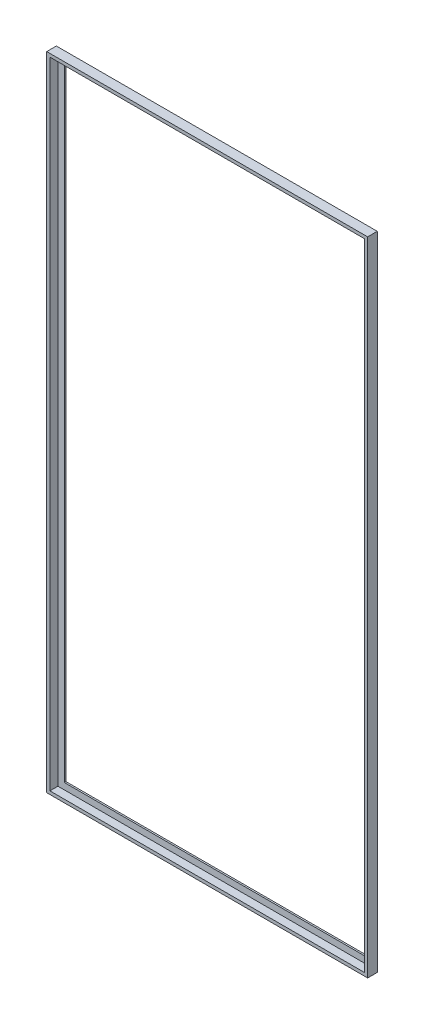
ISO-10303-21;
HEADER;
FILE_DESCRIPTION(('STEP AP214'),'2;1');
FILE_NAME('part.step','',(''),(''),'','','');
FILE_SCHEMA(('AUTOMOTIVE_DESIGN { 1 0 10303 214 1 1 1 1 }'));
ENDSEC;
DATA;
#1=APPLICATION_CONTEXT('core data for automotive mechanical design processes');
#2=APPLICATION_PROTOCOL_DEFINITION('international standard','automotive_design',2000,#1);
#3=PRODUCT_CONTEXT('',#1,'mechanical');
#4=PRODUCT('Part','Part','',(#3));
#5=PRODUCT_RELATED_PRODUCT_CATEGORY('part','',(#4));
#6=PRODUCT_DEFINITION_FORMATION('','',#4);
#7=PRODUCT_DEFINITION_CONTEXT('part definition',#1,'design');
#8=PRODUCT_DEFINITION('design','',#6,#7);
#9=PRODUCT_DEFINITION_SHAPE('','',#8);
#10=(LENGTH_UNIT() NAMED_UNIT(*) SI_UNIT(.MILLI.,.METRE.));
#11=(NAMED_UNIT(*) PLANE_ANGLE_UNIT() SI_UNIT($,.RADIAN.));
#12=(NAMED_UNIT(*) SI_UNIT($,.STERADIAN.) SOLID_ANGLE_UNIT());
#13=UNCERTAINTY_MEASURE_WITH_UNIT(LENGTH_MEASURE(1.E-05),#10,'distance_accuracy_value','');
#14=(GEOMETRIC_REPRESENTATION_CONTEXT(3) GLOBAL_UNCERTAINTY_ASSIGNED_CONTEXT((#13)) GLOBAL_UNIT_ASSIGNED_CONTEXT((#10,
#11,#12)) REPRESENTATION_CONTEXT('',''));
#15=CARTESIAN_POINT('',(0.,0.,0.));
#16=DIRECTION('',(0.,0.,1.));
#17=DIRECTION('',(1.,0.,0.));
#18=AXIS2_PLACEMENT_3D('',#15,#16,#17);
#19=CARTESIAN_POINT('',(0.,30.,5.));
#20=DIRECTION('',(0.,1.,0.));
#21=DIRECTION('',(0.,0.,1.));
#22=AXIS2_PLACEMENT_3D('',#19,#20,#21);
#23=PLANE('',#22);
#24=DIRECTION('',(1.,0.,0.));
#25=VECTOR('',#24,1.);
#26=CARTESIAN_POINT('',(0.,30.,0.));
#27=LINE('',#26,#25);
#28=CARTESIAN_POINT('',(30.,30.,0.));
#29=VERTEX_POINT('',#28);
#30=CARTESIAN_POINT('',(970.,30.,0.));
#31=VERTEX_POINT('',#30);
#32=EDGE_CURVE('E114',#29,#31,#27,.T.);
#33=ORIENTED_EDGE('',*,*,#32,.F.);
#34=DIRECTION('',(0.,0.,-1.));
#35=VECTOR('',#34,1.);
#36=CARTESIAN_POINT('',(30.,30.,5.));
#37=LINE('',#36,#35);
#38=CARTESIAN_POINT('',(30.,30.,5.));
#39=VERTEX_POINT('',#38);
#40=EDGE_CURVE('E11',#39,#29,#37,.T.);
#41=ORIENTED_EDGE('',*,*,#40,.F.);
#42=DIRECTION('',(1.,0.,0.));
#43=VECTOR('',#42,1.);
#44=CARTESIAN_POINT('',(0.,30.,5.));
#45=LINE('',#44,#43);
#46=CARTESIAN_POINT('',(970.,30.,5.));
#47=VERTEX_POINT('',#46);
#48=EDGE_CURVE('E98',#39,#47,#45,.T.);
#49=ORIENTED_EDGE('',*,*,#48,.T.);
#50=DIRECTION('',(0.,0.,-1.));
#51=VECTOR('',#50,1.);
#52=CARTESIAN_POINT('',(970.,30.,5.));
#53=LINE('',#52,#51);
#54=EDGE_CURVE('E48',#47,#31,#53,.T.);
#55=ORIENTED_EDGE('',*,*,#54,.T.);
#56=EDGE_LOOP('',(#33,#41,#49,#55));
#57=FACE_BOUND('',#56,.T.);
#58=ADVANCED_FACE('F32',(#57),#23,.T.);
#59=CARTESIAN_POINT('',(30.,0.,5.));
#60=DIRECTION('',(-1.,0.,0.));
#61=DIRECTION('',(0.,0.,1.));
#62=AXIS2_PLACEMENT_3D('',#59,#60,#61);
#63=PLANE('',#62);
#64=DIRECTION('',(0.,1.,0.));
#65=VECTOR('',#64,1.);
#66=CARTESIAN_POINT('',(30.,0.,0.));
#67=LINE('',#66,#65);
#68=CARTESIAN_POINT('',(30.,1970.,0.));
#69=VERTEX_POINT('',#68);
#70=EDGE_CURVE('E103',#29,#69,#67,.T.);
#71=ORIENTED_EDGE('',*,*,#70,.T.);
#72=DIRECTION('',(0.,0.,-1.));
#73=VECTOR('',#72,1.);
#74=CARTESIAN_POINT('',(30.,1970.,5.));
#75=LINE('',#74,#73);
#76=CARTESIAN_POINT('',(30.,1970.,5.));
#77=VERTEX_POINT('',#76);
#78=EDGE_CURVE('E40',#77,#69,#75,.T.);
#79=ORIENTED_EDGE('',*,*,#78,.F.);
#80=DIRECTION('',(0.,1.,0.));
#81=VECTOR('',#80,1.);
#82=CARTESIAN_POINT('',(30.,0.,5.));
#83=LINE('',#82,#81);
#84=EDGE_CURVE('E93',#39,#77,#83,.T.);
#85=ORIENTED_EDGE('',*,*,#84,.F.);
#86=ORIENTED_EDGE('',*,*,#40,.T.);
#87=EDGE_LOOP('',(#71,#79,#85,#86));
#88=FACE_BOUND('',#87,.T.);
#89=ADVANCED_FACE('F101',(#88),#63,.F.);
#90=CARTESIAN_POINT('',(0.,1970.,5.));
#91=DIRECTION('',(0.,1.,0.));
#92=DIRECTION('',(0.,0.,1.));
#93=AXIS2_PLACEMENT_3D('',#90,#91,#92);
#94=PLANE('',#93);
#95=DIRECTION('',(1.,0.,0.));
#96=VECTOR('',#95,1.);
#97=CARTESIAN_POINT('',(0.,1970.,0.));
#98=LINE('',#97,#96);
#99=CARTESIAN_POINT('',(970.,1970.,0.));
#100=VERTEX_POINT('',#99);
#101=EDGE_CURVE('E111',#69,#100,#98,.T.);
#102=ORIENTED_EDGE('',*,*,#101,.T.);
#103=DIRECTION('',(0.,0.,-1.));
#104=VECTOR('',#103,1.);
#105=CARTESIAN_POINT('',(970.,1970.,5.));
#106=LINE('',#105,#104);
#107=CARTESIAN_POINT('',(970.,1970.,5.));
#108=VERTEX_POINT('',#107);
#109=EDGE_CURVE('E63',#108,#100,#106,.T.);
#110=ORIENTED_EDGE('',*,*,#109,.F.);
#111=DIRECTION('',(1.,0.,0.));
#112=VECTOR('',#111,1.);
#113=CARTESIAN_POINT('',(0.,1970.,5.));
#114=LINE('',#113,#112);
#115=EDGE_CURVE('E85',#77,#108,#114,.T.);
#116=ORIENTED_EDGE('',*,*,#115,.F.);
#117=ORIENTED_EDGE('',*,*,#78,.T.);
#118=EDGE_LOOP('',(#102,#110,#116,#117));
#119=FACE_BOUND('',#118,.T.);
#120=ADVANCED_FACE('F87',(#119),#94,.F.);
#121=CARTESIAN_POINT('',(970.,0.,5.));
#122=DIRECTION('',(-1.,0.,0.));
#123=DIRECTION('',(0.,0.,1.));
#124=AXIS2_PLACEMENT_3D('',#121,#122,#123);
#125=PLANE('',#124);
#126=DIRECTION('',(0.,1.,0.));
#127=VECTOR('',#126,1.);
#128=CARTESIAN_POINT('',(970.,0.,0.));
#129=LINE('',#128,#127);
#130=EDGE_CURVE('E107',#31,#100,#129,.T.);
#131=ORIENTED_EDGE('',*,*,#130,.F.);
#132=ORIENTED_EDGE('',*,*,#54,.F.);
#133=DIRECTION('',(0.,1.,0.));
#134=VECTOR('',#133,1.);
#135=CARTESIAN_POINT('',(970.,0.,5.));
#136=LINE('',#135,#134);
#137=EDGE_CURVE('E92',#47,#108,#136,.T.);
#138=ORIENTED_EDGE('',*,*,#137,.T.);
#139=ORIENTED_EDGE('',*,*,#109,.T.);
#140=EDGE_LOOP('',(#131,#132,#138,#139));
#141=FACE_BOUND('',#140,.T.);
#142=ADVANCED_FACE('F252',(#141),#125,.T.);
#143=CARTESIAN_POINT('',(0.,0.,5.));
#144=DIRECTION('',(0.,0.,1.));
#145=DIRECTION('',(1.,0.,0.));
#146=AXIS2_PLACEMENT_3D('',#143,#144,#145);
#147=PLANE('',#146);
#148=DIRECTION('',(0.,1.,0.));
#149=VECTOR('',#148,1.);
#150=CARTESIAN_POINT('',(10.,0.,5.));
#151=LINE('',#150,#149);
#152=CARTESIAN_POINT('',(10.,10.,5.));
#153=VERTEX_POINT('',#152);
#154=CARTESIAN_POINT('',(10.,1990.,5.));
#155=VERTEX_POINT('',#154);
#156=EDGE_CURVE('E110',#153,#155,#151,.T.);
#157=ORIENTED_EDGE('',*,*,#156,.F.);
#158=DIRECTION('',(1.,0.,0.));
#159=VECTOR('',#158,1.);
#160=CARTESIAN_POINT('',(0.,10.,5.));
#161=LINE('',#160,#159);
#162=CARTESIAN_POINT('',(990.,10.,5.));
#163=VERTEX_POINT('',#162);
#164=EDGE_CURVE('E124',#153,#163,#161,.T.);
#165=ORIENTED_EDGE('',*,*,#164,.T.);
#166=DIRECTION('',(0.,1.,0.));
#167=VECTOR('',#166,1.);
#168=CARTESIAN_POINT('',(990.,0.,5.));
#169=LINE('',#168,#167);
#170=CARTESIAN_POINT('',(990.,1990.,5.));
#171=VERTEX_POINT('',#170);
#172=EDGE_CURVE('E121',#163,#171,#169,.T.);
#173=ORIENTED_EDGE('',*,*,#172,.T.);
#174=DIRECTION('',(1.,0.,0.));
#175=VECTOR('',#174,1.);
#176=CARTESIAN_POINT('',(0.,1990.,5.));
#177=LINE('',#176,#175);
#178=EDGE_CURVE('E119',#155,#171,#177,.T.);
#179=ORIENTED_EDGE('',*,*,#178,.F.);
#180=EDGE_LOOP('',(#157,#165,#173,#179));
#181=FACE_BOUND('',#180,.T.);
#182=ORIENTED_EDGE('',*,*,#48,.F.);
#183=ORIENTED_EDGE('',*,*,#84,.T.);
#184=ORIENTED_EDGE('',*,*,#115,.T.);
#185=ORIENTED_EDGE('',*,*,#137,.F.);
#186=EDGE_LOOP('',(#182,#183,#184,#185));
#187=FACE_BOUND('',#186,.T.);
#188=ADVANCED_FACE('F97',(#181,#187),#147,.T.);
#189=CARTESIAN_POINT('',(0.,0.,0.));
#190=DIRECTION('',(0.,0.,1.));
#191=DIRECTION('',(1.,0.,0.));
#192=AXIS2_PLACEMENT_3D('',#189,#190,#191);
#193=PLANE('',#192);
#194=ORIENTED_EDGE('',*,*,#32,.T.);
#195=ORIENTED_EDGE('',*,*,#130,.T.);
#196=ORIENTED_EDGE('',*,*,#101,.F.);
#197=ORIENTED_EDGE('',*,*,#70,.F.);
#198=EDGE_LOOP('',(#194,#195,#196,#197));
#199=FACE_BOUND('',#198,.T.);
#200=DIRECTION('',(1.,0.,0.));
#201=VECTOR('',#200,1.);
#202=CARTESIAN_POINT('',(0.,0.,0.));
#203=LINE('',#202,#201);
#204=CARTESIAN_POINT('',(0.,0.,0.));
#205=VERTEX_POINT('',#204);
#206=CARTESIAN_POINT('',(1000.,0.,0.));
#207=VERTEX_POINT('',#206);
#208=EDGE_CURVE('E161',#205,#207,#203,.T.);
#209=ORIENTED_EDGE('',*,*,#208,.F.);
#210=DIRECTION('',(0.,1.,0.));
#211=VECTOR('',#210,1.);
#212=CARTESIAN_POINT('',(0.,0.,0.));
#213=LINE('',#212,#211);
#214=CARTESIAN_POINT('',(0.,2000.,0.));
#215=VERTEX_POINT('',#214);
#216=EDGE_CURVE('E151',#205,#215,#213,.T.);
#217=ORIENTED_EDGE('',*,*,#216,.T.);
#218=DIRECTION('',(1.,0.,0.));
#219=VECTOR('',#218,1.);
#220=CARTESIAN_POINT('',(0.,2000.,0.));
#221=LINE('',#220,#219);
#222=CARTESIAN_POINT('',(1000.,2000.,0.));
#223=VERTEX_POINT('',#222);
#224=EDGE_CURVE('E155',#215,#223,#221,.T.);
#225=ORIENTED_EDGE('',*,*,#224,.T.);
#226=DIRECTION('',(0.,1.,0.));
#227=VECTOR('',#226,1.);
#228=CARTESIAN_POINT('',(1000.,0.,0.));
#229=LINE('',#228,#227);
#230=EDGE_CURVE('E158',#207,#223,#229,.T.);
#231=ORIENTED_EDGE('',*,*,#230,.F.);
#232=EDGE_LOOP('',(#209,#217,#225,#231));
#233=FACE_BOUND('',#232,.T.);
#234=ADVANCED_FACE('F250',(#199,#233),#193,.F.);
#235=CARTESIAN_POINT('',(0.,0.,30.));
#236=DIRECTION('',(0.,1.,0.));
#237=DIRECTION('',(0.,0.,1.));
#238=AXIS2_PLACEMENT_3D('',#235,#236,#237);
#239=PLANE('',#238);
#240=ORIENTED_EDGE('',*,*,#208,.T.);
#241=DIRECTION('',(0.,0.,-1.));
#242=VECTOR('',#241,1.);
#243=CARTESIAN_POINT('',(1000.,0.,30.));
#244=LINE('',#243,#242);
#245=CARTESIAN_POINT('',(1000.,0.,30.));
#246=VERTEX_POINT('',#245);
#247=EDGE_CURVE('E116',#246,#207,#244,.T.);
#248=ORIENTED_EDGE('',*,*,#247,.F.);
#249=DIRECTION('',(1.,0.,0.));
#250=VECTOR('',#249,1.);
#251=CARTESIAN_POINT('',(0.,0.,30.));
#252=LINE('',#251,#250);
#253=CARTESIAN_POINT('',(0.,0.,30.));
#254=VERTEX_POINT('',#253);
#255=EDGE_CURVE('E172',#254,#246,#252,.T.);
#256=ORIENTED_EDGE('',*,*,#255,.F.);
#257=DIRECTION('',(0.,0.,-1.));
#258=VECTOR('',#257,1.);
#259=CARTESIAN_POINT('',(0.,0.,30.));
#260=LINE('',#259,#258);
#261=EDGE_CURVE('E132',#254,#205,#260,.T.);
#262=ORIENTED_EDGE('',*,*,#261,.T.);
#263=EDGE_LOOP('',(#240,#248,#256,#262));
#264=FACE_BOUND('',#263,.T.);
#265=ADVANCED_FACE('F263',(#264),#239,.F.);
#266=CARTESIAN_POINT('',(1000.,0.,30.));
#267=DIRECTION('',(-1.,0.,0.));
#268=DIRECTION('',(0.,0.,1.));
#269=AXIS2_PLACEMENT_3D('',#266,#267,#268);
#270=PLANE('',#269);
#271=ORIENTED_EDGE('',*,*,#230,.T.);
#272=DIRECTION('',(0.,0.,-1.));
#273=VECTOR('',#272,1.);
#274=CARTESIAN_POINT('',(1000.,2000.,30.));
#275=LINE('',#274,#273);
#276=CARTESIAN_POINT('',(1000.,2000.,30.));
#277=VERTEX_POINT('',#276);
#278=EDGE_CURVE('E143',#277,#223,#275,.T.);
#279=ORIENTED_EDGE('',*,*,#278,.F.);
#280=DIRECTION('',(0.,1.,0.));
#281=VECTOR('',#280,1.);
#282=CARTESIAN_POINT('',(1000.,0.,30.));
#283=LINE('',#282,#281);
#284=EDGE_CURVE('E169',#246,#277,#283,.T.);
#285=ORIENTED_EDGE('',*,*,#284,.F.);
#286=ORIENTED_EDGE('',*,*,#247,.T.);
#287=EDGE_LOOP('',(#271,#279,#285,#286));
#288=FACE_BOUND('',#287,.T.);
#289=ADVANCED_FACE('F270',(#288),#270,.F.);
#290=CARTESIAN_POINT('',(0.,2000.,30.));
#291=DIRECTION('',(0.,1.,0.));
#292=DIRECTION('',(0.,0.,1.));
#293=AXIS2_PLACEMENT_3D('',#290,#291,#292);
#294=PLANE('',#293);
#295=ORIENTED_EDGE('',*,*,#224,.F.);
#296=DIRECTION('',(0.,0.,-1.));
#297=VECTOR('',#296,1.);
#298=CARTESIAN_POINT('',(0.,2000.,30.));
#299=LINE('',#298,#297);
#300=CARTESIAN_POINT('',(0.,2000.,30.));
#301=VERTEX_POINT('',#300);
#302=EDGE_CURVE('E146',#301,#215,#299,.T.);
#303=ORIENTED_EDGE('',*,*,#302,.F.);
#304=DIRECTION('',(1.,0.,0.));
#305=VECTOR('',#304,1.);
#306=CARTESIAN_POINT('',(0.,2000.,30.));
#307=LINE('',#306,#305);
#308=EDGE_CURVE('E166',#301,#277,#307,.T.);
#309=ORIENTED_EDGE('',*,*,#308,.T.);
#310=ORIENTED_EDGE('',*,*,#278,.T.);
#311=EDGE_LOOP('',(#295,#303,#309,#310));
#312=FACE_BOUND('',#311,.T.);
#313=ADVANCED_FACE('F266',(#312),#294,.T.);
#314=CARTESIAN_POINT('',(0.,10.,30.));
#315=DIRECTION('',(0.,1.,0.));
#316=DIRECTION('',(0.,0.,1.));
#317=AXIS2_PLACEMENT_3D('',#314,#315,#316);
#318=PLANE('',#317);
#319=DIRECTION('',(0.,0.,-1.));
#320=VECTOR('',#319,1.);
#321=CARTESIAN_POINT('',(990.,10.,30.));
#322=LINE('',#321,#320);
#323=CARTESIAN_POINT('',(990.,10.,30.));
#324=VERTEX_POINT('',#323);
#325=EDGE_CURVE('E137',#324,#163,#322,.T.);
#326=ORIENTED_EDGE('',*,*,#325,.T.);
#327=ORIENTED_EDGE('',*,*,#164,.F.);
#328=DIRECTION('',(0.,0.,-1.));
#329=VECTOR('',#328,1.);
#330=CARTESIAN_POINT('',(10.,10.,30.));
#331=LINE('',#330,#329);
#332=CARTESIAN_POINT('',(10.,10.,30.));
#333=VERTEX_POINT('',#332);
#334=EDGE_CURVE('E129',#333,#153,#331,.T.);
#335=ORIENTED_EDGE('',*,*,#334,.F.);
#336=DIRECTION('',(1.,0.,0.));
#337=VECTOR('',#336,1.);
#338=CARTESIAN_POINT('',(0.,10.,30.));
#339=LINE('',#338,#337);
#340=EDGE_CURVE('E154',#333,#324,#339,.T.);
#341=ORIENTED_EDGE('',*,*,#340,.T.);
#342=EDGE_LOOP('',(#326,#327,#335,#341));
#343=FACE_BOUND('',#342,.T.);
#344=ADVANCED_FACE('F189',(#343),#318,.T.);
#345=CARTESIAN_POINT('',(10.,0.,30.));
#346=DIRECTION('',(-1.,0.,0.));
#347=DIRECTION('',(0.,0.,1.));
#348=AXIS2_PLACEMENT_3D('',#345,#346,#347);
#349=PLANE('',#348);
#350=ORIENTED_EDGE('',*,*,#156,.T.);
#351=DIRECTION('',(0.,0.,-1.));
#352=VECTOR('',#351,1.);
#353=CARTESIAN_POINT('',(10.,1990.,30.));
#354=LINE('',#353,#352);
#355=CARTESIAN_POINT('',(10.,1990.,30.));
#356=VERTEX_POINT('',#355);
#357=EDGE_CURVE('E133',#356,#155,#354,.T.);
#358=ORIENTED_EDGE('',*,*,#357,.F.);
#359=DIRECTION('',(0.,1.,0.));
#360=VECTOR('',#359,1.);
#361=CARTESIAN_POINT('',(10.,0.,30.));
#362=LINE('',#361,#360);
#363=EDGE_CURVE('E180',#333,#356,#362,.T.);
#364=ORIENTED_EDGE('',*,*,#363,.F.);
#365=ORIENTED_EDGE('',*,*,#334,.T.);
#366=EDGE_LOOP('',(#350,#358,#364,#365));
#367=FACE_BOUND('',#366,.T.);
#368=ADVANCED_FACE('F232',(#367),#349,.F.);
#369=CARTESIAN_POINT('',(0.,1990.,30.));
#370=DIRECTION('',(0.,1.,0.));
#371=DIRECTION('',(0.,0.,1.));
#372=AXIS2_PLACEMENT_3D('',#369,#370,#371);
#373=PLANE('',#372);
#374=ORIENTED_EDGE('',*,*,#178,.T.);
#375=DIRECTION('',(0.,0.,-1.));
#376=VECTOR('',#375,1.);
#377=CARTESIAN_POINT('',(990.,1990.,30.));
#378=LINE('',#377,#376);
#379=CARTESIAN_POINT('',(990.,1990.,30.));
#380=VERTEX_POINT('',#379);
#381=EDGE_CURVE('E76',#380,#171,#378,.T.);
#382=ORIENTED_EDGE('',*,*,#381,.F.);
#383=DIRECTION('',(1.,0.,0.));
#384=VECTOR('',#383,1.);
#385=CARTESIAN_POINT('',(0.,1990.,30.));
#386=LINE('',#385,#384);
#387=EDGE_CURVE('E177',#356,#380,#386,.T.);
#388=ORIENTED_EDGE('',*,*,#387,.F.);
#389=ORIENTED_EDGE('',*,*,#357,.T.);
#390=EDGE_LOOP('',(#374,#382,#388,#389));
#391=FACE_BOUND('',#390,.T.);
#392=ADVANCED_FACE('F235',(#391),#373,.F.);
#393=CARTESIAN_POINT('',(990.,0.,30.));
#394=DIRECTION('',(-1.,0.,0.));
#395=DIRECTION('',(0.,0.,1.));
#396=AXIS2_PLACEMENT_3D('',#393,#394,#395);
#397=PLANE('',#396);
#398=ORIENTED_EDGE('',*,*,#381,.T.);
#399=ORIENTED_EDGE('',*,*,#172,.F.);
#400=ORIENTED_EDGE('',*,*,#325,.F.);
#401=DIRECTION('',(0.,1.,0.));
#402=VECTOR('',#401,1.);
#403=CARTESIAN_POINT('',(990.,0.,30.));
#404=LINE('',#403,#402);
#405=EDGE_CURVE('E175',#324,#380,#404,.T.);
#406=ORIENTED_EDGE('',*,*,#405,.T.);
#407=EDGE_LOOP('',(#398,#399,#400,#406));
#408=FACE_BOUND('',#407,.T.);
#409=ADVANCED_FACE('F202',(#408),#397,.T.);
#410=CARTESIAN_POINT('',(0.,0.,30.));
#411=DIRECTION('',(-1.,0.,0.));
#412=DIRECTION('',(0.,0.,1.));
#413=AXIS2_PLACEMENT_3D('',#410,#411,#412);
#414=PLANE('',#413);
#415=ORIENTED_EDGE('',*,*,#216,.F.);
#416=ORIENTED_EDGE('',*,*,#261,.F.);
#417=DIRECTION('',(0.,1.,0.));
#418=VECTOR('',#417,1.);
#419=CARTESIAN_POINT('',(0.,0.,30.));
#420=LINE('',#419,#418);
#421=EDGE_CURVE('E140',#254,#301,#420,.T.);
#422=ORIENTED_EDGE('',*,*,#421,.T.);
#423=ORIENTED_EDGE('',*,*,#302,.T.);
#424=EDGE_LOOP('',(#415,#416,#422,#423));
#425=FACE_BOUND('',#424,.T.);
#426=ADVANCED_FACE('F242',(#425),#414,.T.);
#427=CARTESIAN_POINT('',(0.,0.,30.));
#428=DIRECTION('',(0.,0.,1.));
#429=DIRECTION('',(1.,0.,0.));
#430=AXIS2_PLACEMENT_3D('',#427,#428,#429);
#431=PLANE('',#430);
#432=ORIENTED_EDGE('',*,*,#340,.F.);
#433=ORIENTED_EDGE('',*,*,#363,.T.);
#434=ORIENTED_EDGE('',*,*,#387,.T.);
#435=ORIENTED_EDGE('',*,*,#405,.F.);
#436=EDGE_LOOP('',(#432,#433,#434,#435));
#437=FACE_BOUND('',#436,.T.);
#438=ORIENTED_EDGE('',*,*,#255,.T.);
#439=ORIENTED_EDGE('',*,*,#284,.T.);
#440=ORIENTED_EDGE('',*,*,#308,.F.);
#441=ORIENTED_EDGE('',*,*,#421,.F.);
#442=EDGE_LOOP('',(#438,#439,#440,#441));
#443=FACE_BOUND('',#442,.T.);
#444=ADVANCED_FACE('F199',(#437,#443),#431,.T.);
#445=CLOSED_SHELL('',(#58,#89,#120,#142,#188,#234,#265,#289,#313,#344,#368,#392,#409,#426,#444));
#446=MANIFOLD_SOLID_BREP('B2',#445);
#447=ADVANCED_BREP_SHAPE_REPRESENTATION('',(#18,#446),#14);
#448=SHAPE_DEFINITION_REPRESENTATION(#9,#447);
ENDSEC;
END-ISO-10303-21;
